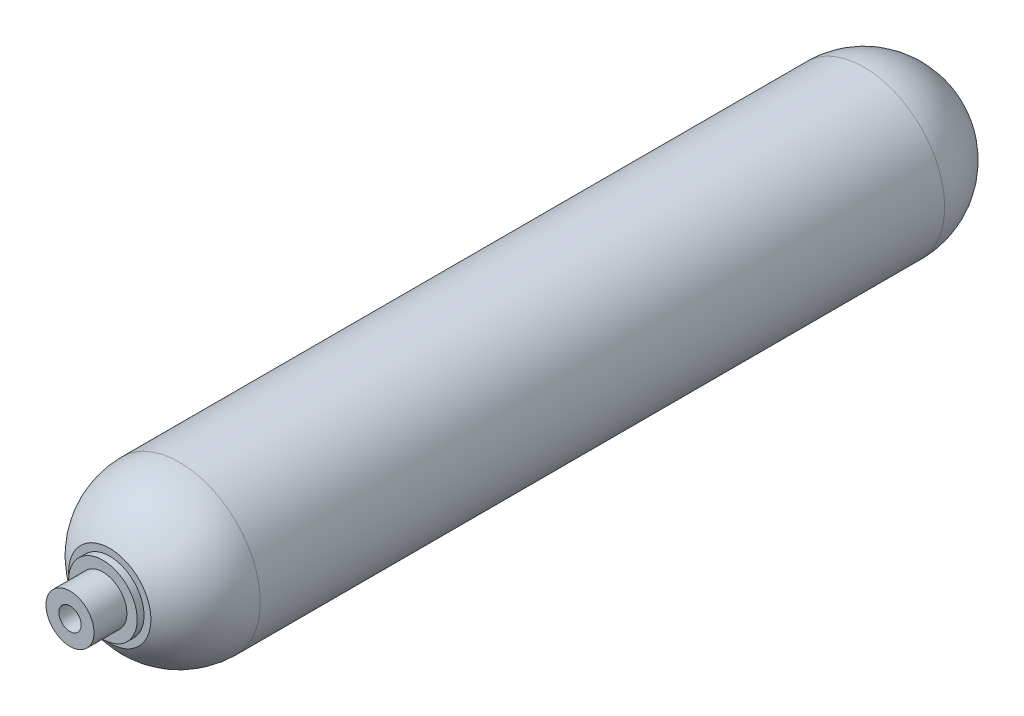
ISO-10303-21;
HEADER;
FILE_DESCRIPTION(('STEP AP214'),'2;1');
FILE_NAME('part.step','',(''),(''),'','','');
FILE_SCHEMA(('AUTOMOTIVE_DESIGN { 1 0 10303 214 1 1 1 1 }'));
ENDSEC;
DATA;
#1=APPLICATION_CONTEXT('core data for automotive mechanical design processes');
#2=APPLICATION_PROTOCOL_DEFINITION('international standard','automotive_design',2000,#1);
#3=PRODUCT_CONTEXT('',#1,'mechanical');
#4=PRODUCT('Part','Part','',(#3));
#5=PRODUCT_RELATED_PRODUCT_CATEGORY('part','',(#4));
#6=PRODUCT_DEFINITION_FORMATION('','',#4);
#7=PRODUCT_DEFINITION_CONTEXT('part definition',#1,'design');
#8=PRODUCT_DEFINITION('design','',#6,#7);
#9=PRODUCT_DEFINITION_SHAPE('','',#8);
#10=(LENGTH_UNIT() NAMED_UNIT(*) SI_UNIT(.MILLI.,.METRE.));
#11=(NAMED_UNIT(*) PLANE_ANGLE_UNIT() SI_UNIT($,.RADIAN.));
#12=(NAMED_UNIT(*) SI_UNIT($,.STERADIAN.) SOLID_ANGLE_UNIT());
#13=UNCERTAINTY_MEASURE_WITH_UNIT(LENGTH_MEASURE(1.E-05),#10,'distance_accuracy_value','');
#14=(GEOMETRIC_REPRESENTATION_CONTEXT(3) GLOBAL_UNCERTAINTY_ASSIGNED_CONTEXT((#13)) GLOBAL_UNIT_ASSIGNED_CONTEXT((#10,
#11,#12)) REPRESENTATION_CONTEXT('',''));
#15=CARTESIAN_POINT('',(0.,0.,0.));
#16=DIRECTION('',(0.,0.,1.));
#17=DIRECTION('',(1.,0.,0.));
#18=AXIS2_PLACEMENT_3D('',#15,#16,#17);
#19=CARTESIAN_POINT('',(0.,0.,-5.08));
#20=DIRECTION('',(0.,0.,1.));
#21=DIRECTION('',(1.,0.,0.));
#22=AXIS2_PLACEMENT_3D('',#19,#20,#21);
#23=PLANE('',#22);
#24=CARTESIAN_POINT('',(0.,0.,-5.08));
#25=DIRECTION('',(0.,0.,1.));
#26=DIRECTION('',(1.,0.,0.));
#27=AXIS2_PLACEMENT_3D('',#24,#25,#26);
#28=CIRCLE('',#27,10.31875);
#29=CARTESIAN_POINT('',(10.31875,0.,-5.08));
#30=VERTEX_POINT('',#29);
#31=EDGE_CURVE('E80',#30,#30,#28,.T.);
#32=ORIENTED_EDGE('',*,*,#31,.T.);
#33=EDGE_LOOP('',(#32));
#34=FACE_BOUND('',#33,.T.);
#35=CARTESIAN_POINT('',(0.,0.,-5.07999999999997));
#36=DIRECTION('',(0.,0.,-1.));
#37=DIRECTION('',(-1.,0.,0.));
#38=AXIS2_PLACEMENT_3D('',#35,#36,#37);
#39=CIRCLE('',#38,26.67);
#40=CARTESIAN_POINT('',(-26.67,0.,-5.07999999999997));
#41=VERTEX_POINT('',#40);
#42=EDGE_CURVE('E56',#41,#41,#39,.T.);
#43=ORIENTED_EDGE('',*,*,#42,.T.);
#44=EDGE_LOOP('',(#43));
#45=FACE_BOUND('',#44,.T.);
#46=ADVANCED_FACE('F36',(#34,#45),#23,.F.);
#47=CARTESIAN_POINT('',(0.,0.,-704.85));
#48=DIRECTION('',(0.,0.,-1.));
#49=DIRECTION('',(-1.,0.,0.));
#50=AXIS2_PLACEMENT_3D('',#47,#48,#49);
#51=CYLINDRICAL_SURFACE('',#50,26.67);
#52=ORIENTED_EDGE('',*,*,#42,.F.);
#53=EDGE_LOOP('',(#52));
#54=FACE_BOUND('',#53,.T.);
#55=CARTESIAN_POINT('',(0.,0.,-11.4300000000001));
#56=DIRECTION('',(0.,0.,-1.));
#57=DIRECTION('',(-1.,0.,0.));
#58=AXIS2_PLACEMENT_3D('',#55,#56,#57);
#59=CIRCLE('',#58,26.67);
#60=CARTESIAN_POINT('',(-26.67,0.,-11.4300000000001));
#61=VERTEX_POINT('',#60);
#62=EDGE_CURVE('E59',#61,#61,#59,.T.);
#63=ORIENTED_EDGE('',*,*,#62,.T.);
#64=EDGE_LOOP('',(#63));
#65=FACE_BOUND('',#64,.T.);
#66=ADVANCED_FACE('F107',(#54,#65),#51,.F.);
#67=CARTESIAN_POINT('',(26.67,0.,-11.43));
#68=DIRECTION('',(0.,0.,1.));
#69=DIRECTION('',(1.,0.,0.));
#70=AXIS2_PLACEMENT_3D('',#67,#68,#69);
#71=PLANE('',#70);
#72=ORIENTED_EDGE('',*,*,#62,.F.);
#73=EDGE_LOOP('',(#72));
#74=FACE_BOUND('',#73,.T.);
#75=CARTESIAN_POINT('',(0.,0.,-11.4299999999999));
#76=DIRECTION('',(0.,0.,-1.));
#77=DIRECTION('',(-1.,0.,0.));
#78=AXIS2_PLACEMENT_3D('',#75,#76,#77);
#79=CIRCLE('',#78,40.1946141094254);
#80=CARTESIAN_POINT('',(-40.1946141094254,0.,-11.4299999999999));
#81=VERTEX_POINT('',#80);
#82=EDGE_CURVE('E62',#81,#81,#79,.T.);
#83=ORIENTED_EDGE('',*,*,#82,.T.);
#84=EDGE_LOOP('',(#83));
#85=FACE_BOUND('',#84,.T.);
#86=ADVANCED_FACE('F113',(#74,#85),#71,.F.);
#87=CARTESIAN_POINT('',(0.,0.,-70.8704998430732));
#88=DIRECTION('',(0.,0.,-1.));
#89=DIRECTION('',(1.,0.,0.));
#90=AXIS2_PLACEMENT_3D('',#87,#88,#89);
#91=SPHERICAL_SURFACE('',#90,71.755);
#92=ORIENTED_EDGE('',*,*,#82,.F.);
#93=EDGE_LOOP('',(#92));
#94=FACE_BOUND('',#93,.T.);
#95=CARTESIAN_POINT('',(0.,0.,-70.8704998430731));
#96=DIRECTION('',(0.,0.,-1.));
#97=DIRECTION('',(-1.,0.,0.));
#98=AXIS2_PLACEMENT_3D('',#95,#96,#97);
#99=CIRCLE('',#98,71.7550000000001);
#100=CARTESIAN_POINT('',(-71.7550000000001,0.,-70.8704998430731));
#101=VERTEX_POINT('',#100);
#102=EDGE_CURVE('E65',#101,#101,#99,.T.);
#103=ORIENTED_EDGE('',*,*,#102,.T.);
#104=EDGE_LOOP('',(#103));
#105=FACE_BOUND('',#104,.T.);
#106=ADVANCED_FACE('F167',(#94,#105),#91,.F.);
#107=CARTESIAN_POINT('',(0.,0.,-704.85));
#108=DIRECTION('',(0.,0.,-1.));
#109=DIRECTION('',(-1.,0.,0.));
#110=AXIS2_PLACEMENT_3D('',#107,#108,#109);
#111=CYLINDRICAL_SURFACE('',#110,71.755);
#112=ORIENTED_EDGE('',*,*,#102,.F.);
#113=EDGE_LOOP('',(#112));
#114=FACE_BOUND('',#113,.T.);
#115=CARTESIAN_POINT('',(0.,0.,-704.85));
#116=DIRECTION('',(0.,0.,-1.));
#117=DIRECTION('',(-1.,0.,0.));
#118=AXIS2_PLACEMENT_3D('',#115,#116,#117);
#119=CIRCLE('',#118,71.7549999999999);
#120=CARTESIAN_POINT('',(-71.7549999999999,0.,-704.85));
#121=VERTEX_POINT('',#120);
#122=EDGE_CURVE('E68',#121,#121,#119,.T.);
#123=ORIENTED_EDGE('',*,*,#122,.T.);
#124=EDGE_LOOP('',(#123));
#125=FACE_BOUND('',#124,.T.);
#126=ADVANCED_FACE('F159',(#114,#125),#111,.F.);
#127=CARTESIAN_POINT('',(0.,0.,-704.85));
#128=DIRECTION('',(0.,0.,-1.));
#129=DIRECTION('',(-1.,0.,0.));
#130=AXIS2_PLACEMENT_3D('',#127,#128,#129);
#131=SPHERICAL_SURFACE('',#130,71.7549999999999);
#132=ORIENTED_EDGE('',*,*,#122,.F.);
#133=EDGE_LOOP('',(#132));
#134=FACE_BOUND('',#133,.T.);
#135=ADVANCED_FACE('F153',(#134),#131,.F.);
#136=CARTESIAN_POINT('',(0.,0.,30.48));
#137=DIRECTION('',(0.,0.,1.));
#138=DIRECTION('',(1.,0.,0.));
#139=AXIS2_PLACEMENT_3D('',#136,#137,#138);
#140=CYLINDRICAL_SURFACE('',#139,10.31875);
#141=CARTESIAN_POINT('',(0.,0.,30.48));
#142=DIRECTION('',(0.,0.,1.));
#143=DIRECTION('',(1.,0.,0.));
#144=AXIS2_PLACEMENT_3D('',#141,#142,#143);
#145=CIRCLE('',#144,10.31875);
#146=CARTESIAN_POINT('',(10.31875,0.,30.48));
#147=VERTEX_POINT('',#146);
#148=EDGE_CURVE('E83',#147,#147,#145,.T.);
#149=ORIENTED_EDGE('',*,*,#148,.T.);
#150=EDGE_LOOP('',(#149));
#151=FACE_BOUND('',#150,.T.);
#152=ORIENTED_EDGE('',*,*,#31,.F.);
#153=EDGE_LOOP('',(#152));
#154=FACE_BOUND('',#153,.T.);
#155=ADVANCED_FACE('F87',(#151,#154),#140,.F.);
#156=CARTESIAN_POINT('',(0.,0.,0.));
#157=DIRECTION('',(0.,0.,-1.));
#158=DIRECTION('',(-1.,0.,0.));
#159=AXIS2_PLACEMENT_3D('',#156,#157,#158);
#160=PLANE('',#159);
#161=CARTESIAN_POINT('',(0.,0.,0.));
#162=DIRECTION('',(0.,0.,-1.));
#163=DIRECTION('',(-1.,0.,0.));
#164=AXIS2_PLACEMENT_3D('',#161,#162,#163);
#165=CIRCLE('',#164,31.75);
#166=CARTESIAN_POINT('',(-31.75,0.,0.));
#167=VERTEX_POINT('',#166);
#168=EDGE_CURVE('E51',#167,#167,#165,.T.);
#169=ORIENTED_EDGE('',*,*,#168,.F.);
#170=EDGE_LOOP('',(#169));
#171=FACE_BOUND('',#170,.T.);
#172=CARTESIAN_POINT('',(0.,0.,0.));
#173=DIRECTION('',(0.,0.,-1.));
#174=DIRECTION('',(-1.,0.,0.));
#175=AXIS2_PLACEMENT_3D('',#172,#173,#174);
#176=CIRCLE('',#175,22.225);
#177=CARTESIAN_POINT('',(-22.225,0.,0.));
#178=VERTEX_POINT('',#177);
#179=EDGE_CURVE('E10',#178,#178,#176,.F.);
#180=ORIENTED_EDGE('',*,*,#179,.F.);
#181=EDGE_LOOP('',(#180));
#182=FACE_BOUND('',#181,.T.);
#183=ADVANCED_FACE('F119',(#171,#182),#160,.F.);
#184=CARTESIAN_POINT('',(0.,0.,-70.8704998430732));
#185=DIRECTION('',(0.,0.,-1.));
#186=DIRECTION('',(1.,0.,0.));
#187=AXIS2_PLACEMENT_3D('',#184,#185,#186);
#188=SPHERICAL_SURFACE('',#187,74.93);
#189=CARTESIAN_POINT('',(0.,0.,-70.8704998430731));
#190=DIRECTION('',(0.,0.,-1.));
#191=DIRECTION('',(-1.,0.,0.));
#192=AXIS2_PLACEMENT_3D('',#189,#190,#191);
#193=CIRCLE('',#192,74.9300000000001);
#194=CARTESIAN_POINT('',(-74.9300000000001,0.,-70.8704998430731));
#195=VERTEX_POINT('',#194);
#196=EDGE_CURVE('E74',#195,#195,#193,.T.);
#197=ORIENTED_EDGE('',*,*,#196,.F.);
#198=EDGE_LOOP('',(#197));
#199=FACE_BOUND('',#198,.T.);
#200=CARTESIAN_POINT('',(0.,0.,-6.34999999999997));
#201=DIRECTION('',(0.,0.,-1.));
#202=DIRECTION('',(-1.,0.,0.));
#203=AXIS2_PLACEMENT_3D('',#200,#201,#202);
#204=CIRCLE('',#203,38.1);
#205=CARTESIAN_POINT('',(-38.1,0.,-6.34999999999997));
#206=VERTEX_POINT('',#205);
#207=EDGE_CURVE('E43',#206,#206,#204,.T.);
#208=ORIENTED_EDGE('',*,*,#207,.T.);
#209=EDGE_LOOP('',(#208));
#210=FACE_BOUND('',#209,.T.);
#211=ADVANCED_FACE('F38',(#199,#210),#188,.T.);
#212=CARTESIAN_POINT('',(31.75,0.,-6.35));
#213=DIRECTION('',(0.,0.,-1.));
#214=DIRECTION('',(-1.,0.,0.));
#215=AXIS2_PLACEMENT_3D('',#212,#213,#214);
#216=PLANE('',#215);
#217=ORIENTED_EDGE('',*,*,#207,.F.);
#218=EDGE_LOOP('',(#217));
#219=FACE_BOUND('',#218,.T.);
#220=CARTESIAN_POINT('',(0.,0.,-6.34999999999997));
#221=DIRECTION('',(0.,0.,-1.));
#222=DIRECTION('',(-1.,0.,0.));
#223=AXIS2_PLACEMENT_3D('',#220,#221,#222);
#224=CIRCLE('',#223,31.75);
#225=CARTESIAN_POINT('',(-31.75,0.,-6.34999999999997));
#226=VERTEX_POINT('',#225);
#227=EDGE_CURVE('E47',#226,#226,#224,.T.);
#228=ORIENTED_EDGE('',*,*,#227,.T.);
#229=EDGE_LOOP('',(#228));
#230=FACE_BOUND('',#229,.T.);
#231=ADVANCED_FACE('F125',(#219,#230),#216,.F.);
#232=CARTESIAN_POINT('',(0.,0.,-704.85));
#233=DIRECTION('',(0.,0.,-1.));
#234=DIRECTION('',(-1.,0.,0.));
#235=AXIS2_PLACEMENT_3D('',#232,#233,#234);
#236=CYLINDRICAL_SURFACE('',#235,31.75);
#237=ORIENTED_EDGE('',*,*,#227,.F.);
#238=EDGE_LOOP('',(#237));
#239=FACE_BOUND('',#238,.T.);
#240=ORIENTED_EDGE('',*,*,#168,.T.);
#241=EDGE_LOOP('',(#240));
#242=FACE_BOUND('',#241,.T.);
#243=ADVANCED_FACE('F123',(#239,#242),#236,.T.);
#244=CARTESIAN_POINT('',(0.,0.,-704.85));
#245=DIRECTION('',(0.,0.,-1.));
#246=DIRECTION('',(1.,0.,0.));
#247=AXIS2_PLACEMENT_3D('',#244,#245,#246);
#248=SPHERICAL_SURFACE('',#247,74.9299999999999);
#249=CARTESIAN_POINT('',(0.,0.,-704.85));
#250=DIRECTION('',(0.,0.,-1.));
#251=DIRECTION('',(-1.,0.,0.));
#252=AXIS2_PLACEMENT_3D('',#249,#250,#251);
#253=CIRCLE('',#252,74.93);
#254=CARTESIAN_POINT('',(-74.93,0.,-704.85));
#255=VERTEX_POINT('',#254);
#256=EDGE_CURVE('E71',#255,#255,#253,.T.);
#257=ORIENTED_EDGE('',*,*,#256,.T.);
#258=EDGE_LOOP('',(#257));
#259=FACE_BOUND('',#258,.T.);
#260=ADVANCED_FACE('F103',(#259),#248,.T.);
#261=CARTESIAN_POINT('',(0.,0.,-704.85));
#262=DIRECTION('',(0.,0.,-1.));
#263=DIRECTION('',(-1.,0.,0.));
#264=AXIS2_PLACEMENT_3D('',#261,#262,#263);
#265=CYLINDRICAL_SURFACE('',#264,74.93);
#266=ORIENTED_EDGE('',*,*,#256,.F.);
#267=EDGE_LOOP('',(#266));
#268=FACE_BOUND('',#267,.T.);
#269=ORIENTED_EDGE('',*,*,#196,.T.);
#270=EDGE_LOOP('',(#269));
#271=FACE_BOUND('',#270,.T.);
#272=ADVANCED_FACE('F98',(#268,#271),#265,.T.);
#273=CARTESIAN_POINT('',(0.,0.,30.48));
#274=DIRECTION('',(0.,0.,-1.));
#275=DIRECTION('',(-1.,0.,0.));
#276=AXIS2_PLACEMENT_3D('',#273,#274,#275);
#277=CYLINDRICAL_SURFACE('',#276,22.225);
#278=CARTESIAN_POINT('',(0.,0.,30.48));
#279=DIRECTION('',(0.,0.,1.));
#280=DIRECTION('',(1.,0.,0.));
#281=AXIS2_PLACEMENT_3D('',#278,#279,#280);
#282=CIRCLE('',#281,22.225);
#283=CARTESIAN_POINT('',(-22.225,0.,30.48));
#284=VERTEX_POINT('',#283);
#285=EDGE_CURVE('E77',#284,#284,#282,.T.);
#286=CARTESIAN_POINT('',(-22.225,0.,30.48));
#287=CARTESIAN_POINT('',(-22.225,0.,30.1625));
#288=CARTESIAN_POINT('',(-22.225,0.,29.845));
#289=CARTESIAN_POINT('',(-22.225,0.,29.21));
#290=CARTESIAN_POINT('',(-22.225,0.,28.8925));
#291=CARTESIAN_POINT('',(-22.225,0.,28.2575));
#292=CARTESIAN_POINT('',(-22.225,0.,27.94));
#293=CARTESIAN_POINT('',(-22.225,0.,27.305));
#294=CARTESIAN_POINT('',(-22.225,0.,26.9875));
#295=CARTESIAN_POINT('',(-22.225,0.,26.3525));
#296=CARTESIAN_POINT('',(-22.225,0.,26.035));
#297=CARTESIAN_POINT('',(-22.225,0.,25.4));
#298=CARTESIAN_POINT('',(-22.225,0.,25.0825));
#299=CARTESIAN_POINT('',(-22.225,0.,24.4475));
#300=CARTESIAN_POINT('',(-22.225,0.,24.13));
#301=CARTESIAN_POINT('',(-22.225,0.,23.495));
#302=CARTESIAN_POINT('',(-22.225,0.,23.1775));
#303=CARTESIAN_POINT('',(-22.225,0.,22.5425));
#304=CARTESIAN_POINT('',(-22.225,0.,22.225));
#305=CARTESIAN_POINT('',(-22.225,0.,21.59));
#306=CARTESIAN_POINT('',(-22.225,0.,21.2725));
#307=CARTESIAN_POINT('',(-22.225,0.,20.6375));
#308=CARTESIAN_POINT('',(-22.225,0.,20.32));
#309=CARTESIAN_POINT('',(-22.225,0.,19.685));
#310=CARTESIAN_POINT('',(-22.225,0.,19.3675));
#311=CARTESIAN_POINT('',(-22.225,0.,18.7325));
#312=CARTESIAN_POINT('',(-22.225,0.,18.415));
#313=CARTESIAN_POINT('',(-22.225,0.,17.78));
#314=CARTESIAN_POINT('',(-22.225,0.,17.4625));
#315=CARTESIAN_POINT('',(-22.225,0.,16.8275));
#316=CARTESIAN_POINT('',(-22.225,0.,16.51));
#317=CARTESIAN_POINT('',(-22.225,0.,15.875));
#318=CARTESIAN_POINT('',(-22.225,0.,15.5575));
#319=CARTESIAN_POINT('',(-22.225,0.,14.9225));
#320=CARTESIAN_POINT('',(-22.225,0.,14.605));
#321=CARTESIAN_POINT('',(-22.225,0.,13.97));
#322=CARTESIAN_POINT('',(-22.225,0.,13.6525));
#323=CARTESIAN_POINT('',(-22.225,0.,13.0175));
#324=CARTESIAN_POINT('',(-22.225,0.,12.7));
#325=CARTESIAN_POINT('',(-22.225,0.,12.065));
#326=CARTESIAN_POINT('',(-22.225,0.,11.7475));
#327=CARTESIAN_POINT('',(-22.225,0.,11.1125));
#328=CARTESIAN_POINT('',(-22.225,0.,10.795));
#329=CARTESIAN_POINT('',(-22.225,0.,10.16));
#330=CARTESIAN_POINT('',(-22.225,0.,9.8425));
#331=CARTESIAN_POINT('',(-22.225,0.,9.2075));
#332=CARTESIAN_POINT('',(-22.225,0.,8.89));
#333=CARTESIAN_POINT('',(-22.225,0.,8.255));
#334=CARTESIAN_POINT('',(-22.225,0.,7.9375));
#335=CARTESIAN_POINT('',(-22.225,0.,7.3025));
#336=CARTESIAN_POINT('',(-22.225,0.,6.985));
#337=CARTESIAN_POINT('',(-22.225,0.,6.35));
#338=CARTESIAN_POINT('',(-22.225,0.,6.0325));
#339=CARTESIAN_POINT('',(-22.225,0.,5.3975));
#340=CARTESIAN_POINT('',(-22.225,0.,5.08));
#341=CARTESIAN_POINT('',(-22.225,0.,4.445));
#342=CARTESIAN_POINT('',(-22.225,0.,4.1275));
#343=CARTESIAN_POINT('',(-22.225,0.,3.4925));
#344=CARTESIAN_POINT('',(-22.225,0.,3.175));
#345=CARTESIAN_POINT('',(-22.225,0.,2.54));
#346=CARTESIAN_POINT('',(-22.225,0.,2.2225));
#347=CARTESIAN_POINT('',(-22.225,0.,1.5875));
#348=CARTESIAN_POINT('',(-22.225,0.,1.27));
#349=CARTESIAN_POINT('',(-22.225,0.,0.634999999999999));
#350=CARTESIAN_POINT('',(-22.225,0.,0.3175));
#351=CARTESIAN_POINT('',(-22.225,0.,0.));
#352=B_SPLINE_CURVE_WITH_KNOTS('',3,(#286,#287,#288,#289,#290,#291,#292,#293,#294,#295,#296,
#297,#298,#299,#300,#301,#302,#303,#304,#305,#306,#307,#308,#309,#310,#311,#312,#313,#314,#315,
#316,#317,#318,#319,#320,#321,#322,#323,#324,#325,#326,#327,#328,#329,#330,#331,#332,#333,#334,
#335,#336,#337,#338,#339,#340,#341,#342,#343,#344,#345,#346,#347,#348,#349,#350,#351),
.UNSPECIFIED.,.F.,.F.,(4,2,2,2,2,2,2,2,2,2,2,2,2,2,2,2,2,2,2,2,2,2,2,2,2,2,2,2,2,2,2,2,4),(0.,
0.952499999999998,1.905,2.8575,3.81,4.7625,5.715,6.6675,7.61999999999999,8.5725,9.525,10.4775,
11.43,12.3825,13.335,14.2875,15.24,16.1925,17.145,18.0975,19.05,20.0025,20.955,21.9075,22.86,
23.8125,24.765,25.7175,26.67,27.6225,28.575,29.5275,30.48),.UNSPECIFIED.);
#353=EDGE_CURVE('BSEAM93',#284,#178,#352,.T.);
#354=ORIENTED_EDGE('',*,*,#285,.F.);
#355=ORIENTED_EDGE('',*,*,#179,.T.);
#356=ORIENTED_EDGE('',*,*,#353,.T.);
#357=ORIENTED_EDGE('',*,*,#353,.F.);
#358=EDGE_LOOP('',(#354,#356,#355,#357));
#359=FACE_BOUND('',#358,.T.);
#360=ADVANCED_FACE('F93',(#359),#277,.T.);
#361=CARTESIAN_POINT('',(0.,0.,30.48));
#362=DIRECTION('',(0.,0.,1.));
#363=DIRECTION('',(1.,0.,0.));
#364=AXIS2_PLACEMENT_3D('',#361,#362,#363);
#365=PLANE('',#364);
#366=ORIENTED_EDGE('',*,*,#148,.F.);
#367=EDGE_LOOP('',(#366));
#368=FACE_BOUND('',#367,.T.);
#369=ORIENTED_EDGE('',*,*,#285,.T.);
#370=EDGE_LOOP('',(#369));
#371=FACE_BOUND('',#370,.T.);
#372=ADVANCED_FACE('F90',(#368,#371),#365,.T.);
#373=CLOSED_SHELL('',(#46,#66,#86,#106,#126,#135,#155,#183,#211,#231,#243,#260,#272,#360,#372));
#374=MANIFOLD_SOLID_BREP('B2',#373);
#375=ADVANCED_BREP_SHAPE_REPRESENTATION('',(#18,#374),#14);
#376=SHAPE_DEFINITION_REPRESENTATION(#9,#375);
ENDSEC;
END-ISO-10303-21;
